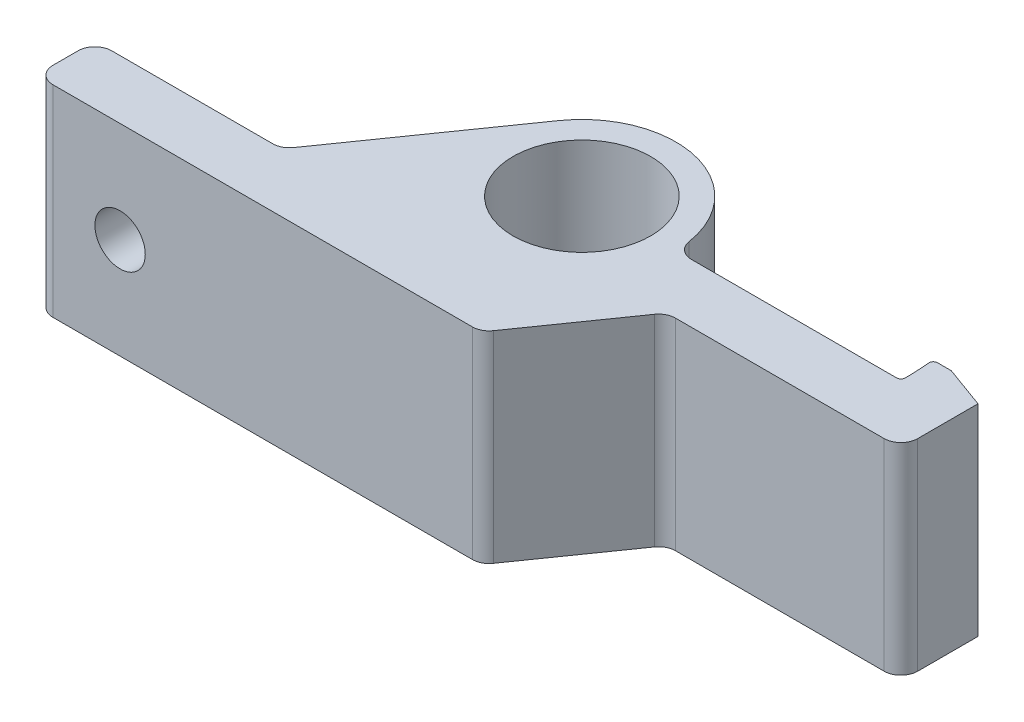
ISO-10303-21;
HEADER;
FILE_DESCRIPTION(('STEP AP214'),'2;1');
FILE_NAME('part.step','',(''),(''),'','','');
FILE_SCHEMA(('AUTOMOTIVE_DESIGN { 1 0 10303 214 1 1 1 1 }'));
ENDSEC;
DATA;
#1=APPLICATION_CONTEXT('core data for automotive mechanical design processes');
#2=APPLICATION_PROTOCOL_DEFINITION('international standard','automotive_design',2000,#1);
#3=PRODUCT_CONTEXT('',#1,'mechanical');
#4=PRODUCT('Part','Part','',(#3));
#5=PRODUCT_RELATED_PRODUCT_CATEGORY('part','',(#4));
#6=PRODUCT_DEFINITION_FORMATION('','',#4);
#7=PRODUCT_DEFINITION_CONTEXT('part definition',#1,'design');
#8=PRODUCT_DEFINITION('design','',#6,#7);
#9=PRODUCT_DEFINITION_SHAPE('','',#8);
#10=(LENGTH_UNIT() NAMED_UNIT(*) SI_UNIT(.MILLI.,.METRE.));
#11=(NAMED_UNIT(*) PLANE_ANGLE_UNIT() SI_UNIT($,.RADIAN.));
#12=(NAMED_UNIT(*) SI_UNIT($,.STERADIAN.) SOLID_ANGLE_UNIT());
#13=UNCERTAINTY_MEASURE_WITH_UNIT(LENGTH_MEASURE(1.E-05),#10,'distance_accuracy_value','');
#14=(GEOMETRIC_REPRESENTATION_CONTEXT(3) GLOBAL_UNCERTAINTY_ASSIGNED_CONTEXT((#13)) GLOBAL_UNIT_ASSIGNED_CONTEXT((#10,
#11,#12)) REPRESENTATION_CONTEXT('',''));
#15=CARTESIAN_POINT('',(0.,0.,0.));
#16=DIRECTION('',(0.,0.,1.));
#17=DIRECTION('',(1.,0.,0.));
#18=AXIS2_PLACEMENT_3D('',#15,#16,#17);
#19=CARTESIAN_POINT('',(0.,6.,0.));
#20=DIRECTION('',(0.,0.,-1.));
#21=DIRECTION('',(-1.,0.,0.));
#22=AXIS2_PLACEMENT_3D('',#19,#20,#21);
#23=PLANE('',#22);
#24=DIRECTION('',(1.,0.,0.));
#25=VECTOR('',#24,1.);
#26=CARTESIAN_POINT('',(0.,6.,0.));
#27=LINE('',#26,#25);
#28=CARTESIAN_POINT('',(1.,6.,0.));
#29=VERTEX_POINT('',#28);
#30=CARTESIAN_POINT('',(25.9794329494483,6.,0.));
#31=VERTEX_POINT('',#30);
#32=EDGE_CURVE('E260',#29,#31,#27,.T.);
#33=ORIENTED_EDGE('',*,*,#32,.F.);
#34=DIRECTION('',(0.,-1.,0.));
#35=VECTOR('',#34,1.);
#36=CARTESIAN_POINT('',(1.,6.,0.));
#37=LINE('',#36,#35);
#38=CARTESIAN_POINT('',(1.,-6.,0.));
#39=VERTEX_POINT('',#38);
#40=EDGE_CURVE('E352',#29,#39,#37,.T.);
#41=ORIENTED_EDGE('',*,*,#40,.T.);
#42=DIRECTION('',(1.,0.,0.));
#43=VECTOR('',#42,1.);
#44=CARTESIAN_POINT('',(0.,-6.,0.));
#45=LINE('',#44,#43);
#46=CARTESIAN_POINT('',(25.9794329494483,-6.,0.));
#47=VERTEX_POINT('',#46);
#48=EDGE_CURVE('E293',#39,#47,#45,.T.);
#49=ORIENTED_EDGE('',*,*,#48,.T.);
#50=DIRECTION('',(0.,-1.,0.));
#51=VECTOR('',#50,1.);
#52=CARTESIAN_POINT('',(25.9794329494483,6.,0.));
#53=LINE('',#52,#51);
#54=EDGE_CURVE('E350',#47,#31,#53,.F.);
#55=ORIENTED_EDGE('',*,*,#54,.T.);
#56=EDGE_LOOP('',(#33,#41,#49,#55));
#57=FACE_BOUND('',#56,.T.);
#58=CARTESIAN_POINT('',(5.,0.,0.));
#59=DIRECTION('',(0.,0.,1.));
#60=DIRECTION('',(1.,0.,0.));
#61=AXIS2_PLACEMENT_3D('',#58,#59,#60);
#62=CIRCLE('',#61,1.49999999999999);
#63=CARTESIAN_POINT('',(6.49999999999999,0.,0.));
#64=VERTEX_POINT('',#63);
#65=EDGE_CURVE('E400',#64,#64,#62,.T.);
#66=ORIENTED_EDGE('',*,*,#65,.F.);
#67=EDGE_LOOP('',(#66));
#68=FACE_BOUND('',#67,.T.);
#69=ADVANCED_FACE('F71',(#57,#68),#23,.F.);
#70=CARTESIAN_POINT('',(22.5,6.,-10.));
#71=DIRECTION('',(0.,1.,0.));
#72=DIRECTION('',(0.,0.,1.));
#73=AXIS2_PLACEMENT_3D('',#70,#71,#72);
#74=PLANE('',#73);
#75=DIRECTION('',(0.93969262078591,0.,0.342020143325663));
#76=VECTOR('',#75,1.);
#77=CARTESIAN_POINT('',(42.5,6.,-12.));
#78=LINE('',#77,#76);
#79=CARTESIAN_POINT('',(42.5,6.,-12.));
#80=VERTEX_POINT('',#79);
#81=CARTESIAN_POINT('',(45.,6.,-11.0900744143345));
#82=VERTEX_POINT('',#81);
#83=EDGE_CURVE('E221',#80,#82,#78,.T.);
#84=ORIENTED_EDGE('',*,*,#83,.F.);
#85=DIRECTION('',(-1.,0.,0.));
#86=VECTOR('',#85,1.);
#87=CARTESIAN_POINT('',(45.,6.,-12.));
#88=LINE('',#87,#86);
#89=CARTESIAN_POINT('',(41.6768946627021,6.,-12.));
#90=VERTEX_POINT('',#89);
#91=EDGE_CURVE('E230',#80,#90,#88,.T.);
#92=ORIENTED_EDGE('',*,*,#91,.T.);
#93=CARTESIAN_POINT('',(41.6768946627021,6.,-11.75));
#94=DIRECTION('',(0.,1.,0.));
#95=DIRECTION('',(0.,0.,1.));
#96=AXIS2_PLACEMENT_3D('',#93,#94,#95);
#97=CIRCLE('',#96,0.25);
#98=CARTESIAN_POINT('',(41.4279291552641,6.,-11.7272804906279));
#99=VERTEX_POINT('',#98);
#100=EDGE_CURVE('E307',#90,#99,#97,.T.);
#101=ORIENTED_EDGE('',*,*,#100,.T.);
#102=CARTESIAN_POINT('',(22.5,6.,-10.));
#103=DIRECTION('',(0.,-1.,0.));
#104=DIRECTION('',(0.,0.,1.));
#105=AXIS2_PLACEMENT_3D('',#102,#103,#104);
#106=CIRCLE('',#105,19.0065778087482);
#107=CARTESIAN_POINT('',(41.5,6.,-10.5));
#108=VERTEX_POINT('',#107);
#109=EDGE_CURVE('E411',#99,#108,#106,.T.);
#110=ORIENTED_EDGE('',*,*,#109,.T.);
#111=DIRECTION('',(0.,0.,1.));
#112=VECTOR('',#111,1.);
#113=CARTESIAN_POINT('',(41.5,6.,-12.));
#114=LINE('',#113,#112);
#115=CARTESIAN_POINT('',(41.5,6.,-10.25));
#116=VERTEX_POINT('',#115);
#117=EDGE_CURVE('E238',#108,#116,#114,.T.);
#118=ORIENTED_EDGE('',*,*,#117,.T.);
#119=CARTESIAN_POINT('',(41.25,6.,-10.25));
#120=DIRECTION('',(0.,1.,0.));
#121=DIRECTION('',(0.,0.,1.));
#122=AXIS2_PLACEMENT_3D('',#119,#120,#121);
#123=CIRCLE('',#122,0.25);
#124=CARTESIAN_POINT('',(41.25,6.,-10.));
#125=VERTEX_POINT('',#124);
#126=EDGE_CURVE('E316',#116,#125,#123,.F.);
#127=ORIENTED_EDGE('',*,*,#126,.T.);
#128=DIRECTION('',(-1.,0.,0.));
#129=VECTOR('',#128,1.);
#130=CARTESIAN_POINT('',(41.5,6.,-10.));
#131=LINE('',#130,#129);
#132=CARTESIAN_POINT('',(29.02380257212,6.,-10.));
#133=VERTEX_POINT('',#132);
#134=EDGE_CURVE('E241',#125,#133,#131,.T.);
#135=ORIENTED_EDGE('',*,*,#134,.T.);
#136=CARTESIAN_POINT('',(29.02380257212,6.,-11.));
#137=DIRECTION('',(0.,1.,0.));
#138=DIRECTION('',(0.,0.,1.));
#139=AXIS2_PLACEMENT_3D('',#136,#137,#138);
#140=CIRCLE('',#139,1.);
#141=CARTESIAN_POINT('',(28.0353476369503,6.,-10.8484848484848));
#142=VERTEX_POINT('',#141);
#143=EDGE_CURVE('E374',#133,#142,#140,.F.);
#144=ORIENTED_EDGE('',*,*,#143,.T.);
#145=CARTESIAN_POINT('',(22.5,6.,-10.));
#146=DIRECTION('',(0.,1.,0.));
#147=DIRECTION('',(0.,0.,1.));
#148=AXIS2_PLACEMENT_3D('',#145,#146,#147);
#149=CIRCLE('',#148,5.6);
#150=CARTESIAN_POINT('',(17.9127485519817,6.,-13.2120280435659));
#151=VERTEX_POINT('',#150);
#152=EDGE_CURVE('E249',#142,#151,#149,.T.);
#153=ORIENTED_EDGE('',*,*,#152,.T.);
#154=DIRECTION('',(0.57357643635105,0.,-0.819152044288989));
#155=VECTOR('',#154,1.);
#156=CARTESIAN_POINT('',(11.1123133045727,6.,-3.5));
#157=LINE('',#156,#155);
#158=CARTESIAN_POINT('',(11.4108982983099,6.,-3.92642356364895));
#159=VERTEX_POINT('',#158);
#160=EDGE_CURVE('E251',#159,#151,#157,.T.);
#161=ORIENTED_EDGE('',*,*,#160,.F.);
#162=CARTESIAN_POINT('',(10.5917462540209,6.,-4.5));
#163=DIRECTION('',(0.,1.,0.));
#164=DIRECTION('',(0.,0.,1.));
#165=AXIS2_PLACEMENT_3D('',#162,#163,#164);
#166=CIRCLE('',#165,1.);
#167=CARTESIAN_POINT('',(10.5917462540209,6.,-3.5));
#168=VERTEX_POINT('',#167);
#169=EDGE_CURVE('E370',#159,#168,#166,.F.);
#170=ORIENTED_EDGE('',*,*,#169,.T.);
#171=DIRECTION('',(-1.,0.,0.));
#172=VECTOR('',#171,1.);
#173=CARTESIAN_POINT('',(11.1123133045727,6.,-3.5));
#174=LINE('',#173,#172);
#175=CARTESIAN_POINT('',(1.,6.,-3.5));
#176=VERTEX_POINT('',#175);
#177=EDGE_CURVE('E254',#168,#176,#174,.T.);
#178=ORIENTED_EDGE('',*,*,#177,.T.);
#179=CARTESIAN_POINT('',(1.,6.,-2.5));
#180=DIRECTION('',(0.,1.,0.));
#181=DIRECTION('',(0.,0.,1.));
#182=AXIS2_PLACEMENT_3D('',#179,#180,#181);
#183=CIRCLE('',#182,1.);
#184=CARTESIAN_POINT('',(0.,6.,-2.5));
#185=VERTEX_POINT('',#184);
#186=EDGE_CURVE('E348',#176,#185,#183,.T.);
#187=ORIENTED_EDGE('',*,*,#186,.T.);
#188=DIRECTION('',(0.,0.,1.));
#189=VECTOR('',#188,1.);
#190=CARTESIAN_POINT('',(0.,6.,-3.5));
#191=LINE('',#190,#189);
#192=CARTESIAN_POINT('',(0.,6.,-1.));
#193=VERTEX_POINT('',#192);
#194=EDGE_CURVE('E257',#185,#193,#191,.T.);
#195=ORIENTED_EDGE('',*,*,#194,.T.);
#196=CARTESIAN_POINT('',(1.,6.,-1.));
#197=DIRECTION('',(0.,1.,0.));
#198=DIRECTION('',(0.,0.,1.));
#199=AXIS2_PLACEMENT_3D('',#196,#197,#198);
#200=CIRCLE('',#199,1.);
#201=EDGE_CURVE('E346',#193,#29,#200,.T.);
#202=ORIENTED_EDGE('',*,*,#201,.T.);
#203=ORIENTED_EDGE('',*,*,#32,.T.);
#204=CARTESIAN_POINT('',(25.9794329494483,6.,-1.));
#205=DIRECTION('',(0.,1.,0.));
#206=DIRECTION('',(0.,0.,1.));
#207=AXIS2_PLACEMENT_3D('',#204,#205,#206);
#208=CIRCLE('',#207,1.);
#209=CARTESIAN_POINT('',(26.7985849937372,6.,-0.426423563648957));
#210=VERTEX_POINT('',#209);
#211=EDGE_CURVE('E343',#31,#210,#208,.T.);
#212=ORIENTED_EDGE('',*,*,#211,.T.);
#213=DIRECTION('',(0.573576436351044,0.,-0.819152044288993));
#214=VECTOR('',#213,1.);
#215=CARTESIAN_POINT('',(26.5,6.,0.));
#216=LINE('',#215,#214);
#217=CARTESIAN_POINT('',(30.7527640046258,6.,-6.07357643635105));
#218=VERTEX_POINT('',#217);
#219=EDGE_CURVE('E263',#210,#218,#216,.T.);
#220=ORIENTED_EDGE('',*,*,#219,.T.);
#221=CARTESIAN_POINT('',(31.5719160489148,6.,-5.5));
#222=DIRECTION('',(0.,1.,0.));
#223=DIRECTION('',(0.,0.,1.));
#224=AXIS2_PLACEMENT_3D('',#221,#222,#223);
#225=CIRCLE('',#224,1.);
#226=CARTESIAN_POINT('',(31.5719160489148,6.,-6.5));
#227=VERTEX_POINT('',#226);
#228=EDGE_CURVE('E12',#218,#227,#225,.F.);
#229=ORIENTED_EDGE('',*,*,#228,.T.);
#230=DIRECTION('',(1.,0.,0.));
#231=VECTOR('',#230,1.);
#232=CARTESIAN_POINT('',(31.0513489983631,6.,-6.5));
#233=LINE('',#232,#231);
#234=CARTESIAN_POINT('',(44.,6.,-6.5));
#235=VERTEX_POINT('',#234);
#236=EDGE_CURVE('E243',#227,#235,#233,.T.);
#237=ORIENTED_EDGE('',*,*,#236,.T.);
#238=CARTESIAN_POINT('',(44.,6.,-7.5));
#239=DIRECTION('',(0.,1.,0.));
#240=DIRECTION('',(0.,0.,1.));
#241=AXIS2_PLACEMENT_3D('',#238,#239,#240);
#242=CIRCLE('',#241,1.);
#243=CARTESIAN_POINT('',(45.,6.,-7.5));
#244=VERTEX_POINT('',#243);
#245=EDGE_CURVE('E94',#235,#244,#242,.T.);
#246=ORIENTED_EDGE('',*,*,#245,.T.);
#247=DIRECTION('',(0.,0.,-1.));
#248=VECTOR('',#247,1.);
#249=CARTESIAN_POINT('',(45.,6.,-6.5));
#250=LINE('',#249,#248);
#251=EDGE_CURVE('E232',#244,#82,#250,.T.);
#252=ORIENTED_EDGE('',*,*,#251,.T.);
#253=EDGE_LOOP('',(#84,#92,#101,#110,#118,#127,#135,#144,#153,#161,#170,#178,#187,#195,#202,
#203,#212,#220,#229,#237,#246,#252));
#254=FACE_BOUND('',#253,.T.);
#255=CARTESIAN_POINT('',(22.5,6.,-10.));
#256=DIRECTION('',(0.,1.,0.));
#257=DIRECTION('',(0.,0.,1.));
#258=AXIS2_PLACEMENT_3D('',#255,#256,#257);
#259=CIRCLE('',#258,4.1);
#260=CARTESIAN_POINT('',(22.5,6.,-5.9));
#261=VERTEX_POINT('',#260);
#262=EDGE_CURVE('E271',#261,#261,#259,.T.);
#263=ORIENTED_EDGE('',*,*,#262,.F.);
#264=EDGE_LOOP('',(#263));
#265=FACE_BOUND('',#264,.T.);
#266=ADVANCED_FACE('F228',(#254,#265),#74,.T.);
#267=CARTESIAN_POINT('',(22.5,-6.,-10.));
#268=DIRECTION('',(0.,1.,0.));
#269=DIRECTION('',(0.,0.,1.));
#270=AXIS2_PLACEMENT_3D('',#267,#268,#269);
#271=PLANE('',#270);
#272=DIRECTION('',(-1.,0.,0.));
#273=VECTOR('',#272,1.);
#274=CARTESIAN_POINT('',(45.,-6.,-12.));
#275=LINE('',#274,#273);
#276=CARTESIAN_POINT('',(42.5,-6.,-12.));
#277=VERTEX_POINT('',#276);
#278=CARTESIAN_POINT('',(41.6768946627021,-6.,-12.));
#279=VERTEX_POINT('',#278);
#280=EDGE_CURVE('E274',#277,#279,#275,.T.);
#281=ORIENTED_EDGE('',*,*,#280,.F.);
#282=DIRECTION('',(-0.93969262078591,0.,-0.342020143325663));
#283=VECTOR('',#282,1.);
#284=CARTESIAN_POINT('',(42.5,-6.,-12.));
#285=LINE('',#284,#283);
#286=CARTESIAN_POINT('',(45.,-6.,-11.0900744143345));
#287=VERTEX_POINT('',#286);
#288=EDGE_CURVE('E86',#287,#277,#285,.T.);
#289=ORIENTED_EDGE('',*,*,#288,.F.);
#290=DIRECTION('',(0.,0.,-1.));
#291=VECTOR('',#290,1.);
#292=CARTESIAN_POINT('',(45.,-6.,-6.5));
#293=LINE('',#292,#291);
#294=CARTESIAN_POINT('',(45.,-6.,-7.5));
#295=VERTEX_POINT('',#294);
#296=EDGE_CURVE('E270',#295,#287,#293,.T.);
#297=ORIENTED_EDGE('',*,*,#296,.F.);
#298=CARTESIAN_POINT('',(44.,-6.,-7.5));
#299=DIRECTION('',(0.,1.,0.));
#300=DIRECTION('',(0.,0.,1.));
#301=AXIS2_PLACEMENT_3D('',#298,#299,#300);
#302=CIRCLE('',#301,1.);
#303=CARTESIAN_POINT('',(44.,-6.,-6.5));
#304=VERTEX_POINT('',#303);
#305=EDGE_CURVE('E337',#295,#304,#302,.F.);
#306=ORIENTED_EDGE('',*,*,#305,.T.);
#307=DIRECTION('',(1.,0.,0.));
#308=VECTOR('',#307,1.);
#309=CARTESIAN_POINT('',(31.0513489983631,-6.,-6.5));
#310=LINE('',#309,#308);
#311=CARTESIAN_POINT('',(31.5719160489148,-6.,-6.5));
#312=VERTEX_POINT('',#311);
#313=EDGE_CURVE('E267',#312,#304,#310,.T.);
#314=ORIENTED_EDGE('',*,*,#313,.F.);
#315=CARTESIAN_POINT('',(31.5719160489148,-6.,-5.5));
#316=DIRECTION('',(0.,1.,0.));
#317=DIRECTION('',(0.,0.,1.));
#318=AXIS2_PLACEMENT_3D('',#315,#316,#317);
#319=CIRCLE('',#318,1.);
#320=CARTESIAN_POINT('',(30.7527640046258,-6.,-6.07357643635105));
#321=VERTEX_POINT('',#320);
#322=EDGE_CURVE('E79',#312,#321,#319,.T.);
#323=ORIENTED_EDGE('',*,*,#322,.T.);
#324=DIRECTION('',(0.573576436351044,0.,-0.819152044288993));
#325=VECTOR('',#324,1.);
#326=CARTESIAN_POINT('',(26.5,-6.,0.));
#327=LINE('',#326,#325);
#328=CARTESIAN_POINT('',(26.7985849937372,-6.,-0.426423563648957));
#329=VERTEX_POINT('',#328);
#330=EDGE_CURVE('E296',#329,#321,#327,.T.);
#331=ORIENTED_EDGE('',*,*,#330,.F.);
#332=CARTESIAN_POINT('',(25.9794329494483,-6.,-1.));
#333=DIRECTION('',(0.,1.,0.));
#334=DIRECTION('',(0.,0.,1.));
#335=AXIS2_PLACEMENT_3D('',#332,#333,#334);
#336=CIRCLE('',#335,1.);
#337=EDGE_CURVE('E335',#329,#47,#336,.F.);
#338=ORIENTED_EDGE('',*,*,#337,.T.);
#339=ORIENTED_EDGE('',*,*,#48,.F.);
#340=CARTESIAN_POINT('',(1.,-6.,-1.));
#341=DIRECTION('',(0.,1.,0.));
#342=DIRECTION('',(0.,0.,1.));
#343=AXIS2_PLACEMENT_3D('',#340,#341,#342);
#344=CIRCLE('',#343,1.);
#345=CARTESIAN_POINT('',(0.,-6.,-1.));
#346=VERTEX_POINT('',#345);
#347=EDGE_CURVE('E339',#39,#346,#344,.F.);
#348=ORIENTED_EDGE('',*,*,#347,.T.);
#349=DIRECTION('',(0.,0.,1.));
#350=VECTOR('',#349,1.);
#351=CARTESIAN_POINT('',(0.,-6.,-3.5));
#352=LINE('',#351,#350);
#353=CARTESIAN_POINT('',(0.,-6.,-2.5));
#354=VERTEX_POINT('',#353);
#355=EDGE_CURVE('E290',#354,#346,#352,.T.);
#356=ORIENTED_EDGE('',*,*,#355,.F.);
#357=CARTESIAN_POINT('',(1.,-6.,-2.5));
#358=DIRECTION('',(0.,1.,0.));
#359=DIRECTION('',(0.,0.,1.));
#360=AXIS2_PLACEMENT_3D('',#357,#358,#359);
#361=CIRCLE('',#360,1.);
#362=CARTESIAN_POINT('',(1.,-6.,-3.5));
#363=VERTEX_POINT('',#362);
#364=EDGE_CURVE('E341',#354,#363,#361,.F.);
#365=ORIENTED_EDGE('',*,*,#364,.T.);
#366=DIRECTION('',(-1.,0.,0.));
#367=VECTOR('',#366,1.);
#368=CARTESIAN_POINT('',(11.1123133045727,-6.,-3.5));
#369=LINE('',#368,#367);
#370=CARTESIAN_POINT('',(10.5917462540209,-6.,-3.5));
#371=VERTEX_POINT('',#370);
#372=EDGE_CURVE('E287',#371,#363,#369,.T.);
#373=ORIENTED_EDGE('',*,*,#372,.F.);
#374=CARTESIAN_POINT('',(10.5917462540209,-6.,-4.5));
#375=DIRECTION('',(0.,1.,0.));
#376=DIRECTION('',(0.,0.,1.));
#377=AXIS2_PLACEMENT_3D('',#374,#375,#376);
#378=CIRCLE('',#377,1.);
#379=CARTESIAN_POINT('',(11.4108982983099,-6.,-3.92642356364895));
#380=VERTEX_POINT('',#379);
#381=EDGE_CURVE('E368',#371,#380,#378,.T.);
#382=ORIENTED_EDGE('',*,*,#381,.T.);
#383=DIRECTION('',(0.57357643635105,0.,-0.819152044288989));
#384=VECTOR('',#383,1.);
#385=CARTESIAN_POINT('',(11.1123133045727,-6.,-3.5));
#386=LINE('',#385,#384);
#387=CARTESIAN_POINT('',(17.9127485519817,-6.,-13.2120280435659));
#388=VERTEX_POINT('',#387);
#389=EDGE_CURVE('E284',#380,#388,#386,.T.);
#390=ORIENTED_EDGE('',*,*,#389,.T.);
#391=CARTESIAN_POINT('',(22.5,-6.,-10.));
#392=DIRECTION('',(0.,1.,0.));
#393=DIRECTION('',(0.,0.,1.));
#394=AXIS2_PLACEMENT_3D('',#391,#392,#393);
#395=CIRCLE('',#394,5.6);
#396=CARTESIAN_POINT('',(28.0353476369503,-6.,-10.8484848484848));
#397=VERTEX_POINT('',#396);
#398=EDGE_CURVE('E282',#397,#388,#395,.T.);
#399=ORIENTED_EDGE('',*,*,#398,.F.);
#400=CARTESIAN_POINT('',(29.02380257212,-6.,-11.));
#401=DIRECTION('',(0.,1.,0.));
#402=DIRECTION('',(0.,0.,1.));
#403=AXIS2_PLACEMENT_3D('',#400,#401,#402);
#404=CIRCLE('',#403,1.);
#405=CARTESIAN_POINT('',(29.02380257212,-6.,-10.));
#406=VERTEX_POINT('',#405);
#407=EDGE_CURVE('E372',#397,#406,#404,.T.);
#408=ORIENTED_EDGE('',*,*,#407,.T.);
#409=DIRECTION('',(-1.,0.,0.));
#410=VECTOR('',#409,1.);
#411=CARTESIAN_POINT('',(41.5,-6.,-10.));
#412=LINE('',#411,#410);
#413=CARTESIAN_POINT('',(41.25,-6.,-10.));
#414=VERTEX_POINT('',#413);
#415=EDGE_CURVE('E279',#414,#406,#412,.T.);
#416=ORIENTED_EDGE('',*,*,#415,.F.);
#417=CARTESIAN_POINT('',(41.25,-6.,-10.25));
#418=DIRECTION('',(0.,1.,0.));
#419=DIRECTION('',(0.,0.,1.));
#420=AXIS2_PLACEMENT_3D('',#417,#418,#419);
#421=CIRCLE('',#420,0.25);
#422=CARTESIAN_POINT('',(41.5,-6.,-10.25));
#423=VERTEX_POINT('',#422);
#424=EDGE_CURVE('E314',#414,#423,#421,.T.);
#425=ORIENTED_EDGE('',*,*,#424,.T.);
#426=DIRECTION('',(0.,0.,1.));
#427=VECTOR('',#426,1.);
#428=CARTESIAN_POINT('',(41.5,-6.,-12.));
#429=LINE('',#428,#427);
#430=CARTESIAN_POINT('',(41.5,-6.,-10.5));
#431=VERTEX_POINT('',#430);
#432=EDGE_CURVE('E276',#431,#423,#429,.T.);
#433=ORIENTED_EDGE('',*,*,#432,.F.);
#434=CARTESIAN_POINT('',(22.5,-6.,-10.));
#435=DIRECTION('',(0.,1.,0.));
#436=DIRECTION('',(0.,0.,1.));
#437=AXIS2_PLACEMENT_3D('',#434,#435,#436);
#438=CIRCLE('',#437,19.0065778087482);
#439=CARTESIAN_POINT('',(41.4279291552641,-6.,-11.7272804906279));
#440=VERTEX_POINT('',#439);
#441=EDGE_CURVE('E403',#431,#440,#438,.T.);
#442=ORIENTED_EDGE('',*,*,#441,.T.);
#443=CARTESIAN_POINT('',(41.6768946627021,-6.,-11.75));
#444=DIRECTION('',(0.,1.,0.));
#445=DIRECTION('',(0.,0.,1.));
#446=AXIS2_PLACEMENT_3D('',#443,#444,#445);
#447=CIRCLE('',#446,0.25);
#448=EDGE_CURVE('E311',#440,#279,#447,.F.);
#449=ORIENTED_EDGE('',*,*,#448,.T.);
#450=EDGE_LOOP('',(#281,#289,#297,#306,#314,#323,#331,#338,#339,#348,#356,#365,#373,#382,#390,
#399,#408,#416,#425,#433,#442,#449));
#451=FACE_BOUND('',#450,.T.);
#452=CARTESIAN_POINT('',(22.5,-6.,-10.));
#453=DIRECTION('',(0.,1.,0.));
#454=DIRECTION('',(0.,0.,1.));
#455=AXIS2_PLACEMENT_3D('',#452,#453,#454);
#456=CIRCLE('',#455,4.1);
#457=CARTESIAN_POINT('',(22.5,-6.,-5.9));
#458=VERTEX_POINT('',#457);
#459=EDGE_CURVE('E394',#458,#458,#456,.T.);
#460=ORIENTED_EDGE('',*,*,#459,.T.);
#461=EDGE_LOOP('',(#460));
#462=FACE_BOUND('',#461,.T.);
#463=ADVANCED_FACE('F378',(#451,#462),#271,.F.);
#464=CARTESIAN_POINT('',(31.0513489983631,6.,-6.5));
#465=DIRECTION('',(0.,0.,-1.));
#466=DIRECTION('',(-1.,0.,0.));
#467=AXIS2_PLACEMENT_3D('',#464,#465,#466);
#468=PLANE('',#467);
#469=ORIENTED_EDGE('',*,*,#313,.T.);
#470=DIRECTION('',(0.,-1.,0.));
#471=VECTOR('',#470,1.);
#472=CARTESIAN_POINT('',(44.,6.,-6.5));
#473=LINE('',#472,#471);
#474=EDGE_CURVE('E361',#304,#235,#473,.F.);
#475=ORIENTED_EDGE('',*,*,#474,.T.);
#476=ORIENTED_EDGE('',*,*,#236,.F.);
#477=DIRECTION('',(0.,-1.,0.));
#478=VECTOR('',#477,1.);
#479=CARTESIAN_POINT('',(31.5719160489148,-6.,-6.5));
#480=LINE('',#479,#478);
#481=EDGE_CURVE('E358',#227,#312,#480,.T.);
#482=ORIENTED_EDGE('',*,*,#481,.T.);
#483=EDGE_LOOP('',(#469,#475,#476,#482));
#484=FACE_BOUND('',#483,.T.);
#485=ADVANCED_FACE('F391',(#484),#468,.F.);
#486=CARTESIAN_POINT('',(45.,6.,-6.5));
#487=DIRECTION('',(-1.,0.,0.));
#488=DIRECTION('',(0.,0.,1.));
#489=AXIS2_PLACEMENT_3D('',#486,#487,#488);
#490=PLANE('',#489);
#491=ORIENTED_EDGE('',*,*,#296,.T.);
#492=DIRECTION('',(0.,1.,0.));
#493=VECTOR('',#492,1.);
#494=CARTESIAN_POINT('',(45.,-8.66044443118978,-11.0900744143345));
#495=LINE('',#494,#493);
#496=EDGE_CURVE('E226',#287,#82,#495,.T.);
#497=ORIENTED_EDGE('',*,*,#496,.T.);
#498=ORIENTED_EDGE('',*,*,#251,.F.);
#499=DIRECTION('',(0.,-1.,0.));
#500=VECTOR('',#499,1.);
#501=CARTESIAN_POINT('',(45.,6.,-7.5));
#502=LINE('',#501,#500);
#503=EDGE_CURVE('E355',#244,#295,#502,.T.);
#504=ORIENTED_EDGE('',*,*,#503,.T.);
#505=EDGE_LOOP('',(#491,#497,#498,#504));
#506=FACE_BOUND('',#505,.T.);
#507=ADVANCED_FACE('F415',(#506),#490,.F.);
#508=CARTESIAN_POINT('',(45.,6.,-12.));
#509=DIRECTION('',(0.,0.,1.));
#510=DIRECTION('',(1.,0.,0.));
#511=AXIS2_PLACEMENT_3D('',#508,#509,#510);
#512=PLANE('',#511);
#513=ORIENTED_EDGE('',*,*,#91,.F.);
#514=DIRECTION('',(0.,1.,0.));
#515=VECTOR('',#514,1.);
#516=CARTESIAN_POINT('',(42.5,-8.66044443118978,-12.));
#517=LINE('',#516,#515);
#518=EDGE_CURVE('E218',#277,#80,#517,.T.);
#519=ORIENTED_EDGE('',*,*,#518,.F.);
#520=ORIENTED_EDGE('',*,*,#280,.T.);
#521=DIRECTION('',(0.,-1.,0.));
#522=VECTOR('',#521,1.);
#523=CARTESIAN_POINT('',(41.6768946627021,6.,-12.));
#524=LINE('',#523,#522);
#525=EDGE_CURVE('E237',#279,#90,#524,.F.);
#526=ORIENTED_EDGE('',*,*,#525,.T.);
#527=EDGE_LOOP('',(#513,#519,#520,#526));
#528=FACE_BOUND('',#527,.T.);
#529=ADVANCED_FACE('F235',(#528),#512,.F.);
#530=CARTESIAN_POINT('',(41.5,6.,-12.));
#531=DIRECTION('',(1.,0.,0.));
#532=DIRECTION('',(0.,0.,-1.));
#533=AXIS2_PLACEMENT_3D('',#530,#531,#532);
#534=PLANE('',#533);
#535=ORIENTED_EDGE('',*,*,#432,.T.);
#536=DIRECTION('',(0.,-1.,0.));
#537=VECTOR('',#536,1.);
#538=CARTESIAN_POINT('',(41.5,6.,-10.25));
#539=LINE('',#538,#537);
#540=EDGE_CURVE('E304',#423,#116,#539,.F.);
#541=ORIENTED_EDGE('',*,*,#540,.T.);
#542=ORIENTED_EDGE('',*,*,#117,.F.);
#543=DIRECTION('',(0.,1.,0.));
#544=VECTOR('',#543,1.);
#545=CARTESIAN_POINT('',(41.5,-7.50325962010547,-10.5));
#546=LINE('',#545,#544);
#547=EDGE_CURVE('E408',#431,#108,#546,.T.);
#548=ORIENTED_EDGE('',*,*,#547,.F.);
#549=EDGE_LOOP('',(#535,#541,#542,#548));
#550=FACE_BOUND('',#549,.T.);
#551=ADVANCED_FACE('F429',(#550),#534,.F.);
#552=CARTESIAN_POINT('',(41.5,6.,-10.));
#553=DIRECTION('',(0.,0.,1.));
#554=DIRECTION('',(1.,0.,0.));
#555=AXIS2_PLACEMENT_3D('',#552,#553,#554);
#556=PLANE('',#555);
#557=ORIENTED_EDGE('',*,*,#415,.T.);
#558=DIRECTION('',(0.,1.,0.));
#559=VECTOR('',#558,1.);
#560=CARTESIAN_POINT('',(29.02380257212,6.,-10.));
#561=LINE('',#560,#559);
#562=EDGE_CURVE('E328',#406,#133,#561,.T.);
#563=ORIENTED_EDGE('',*,*,#562,.T.);
#564=ORIENTED_EDGE('',*,*,#134,.F.);
#565=DIRECTION('',(0.,-1.,0.));
#566=VECTOR('',#565,1.);
#567=CARTESIAN_POINT('',(41.25,-6.,-10.));
#568=LINE('',#567,#566);
#569=EDGE_CURVE('E301',#125,#414,#568,.T.);
#570=ORIENTED_EDGE('',*,*,#569,.T.);
#571=EDGE_LOOP('',(#557,#563,#564,#570));
#572=FACE_BOUND('',#571,.T.);
#573=ADVANCED_FACE('F438',(#572),#556,.F.);
#574=CARTESIAN_POINT('',(22.5,6.,-10.));
#575=DIRECTION('',(0.,-1.,0.));
#576=DIRECTION('',(0.,0.,-1.));
#577=AXIS2_PLACEMENT_3D('',#574,#575,#576);
#578=CYLINDRICAL_SURFACE('',#577,5.6);
#579=ORIENTED_EDGE('',*,*,#152,.F.);
#580=DIRECTION('',(0.,-1.,0.));
#581=VECTOR('',#580,1.);
#582=CARTESIAN_POINT('',(28.0353476369503,6.,-10.8484848484848));
#583=LINE('',#582,#581);
#584=EDGE_CURVE('E325',#142,#397,#583,.T.);
#585=ORIENTED_EDGE('',*,*,#584,.T.);
#586=ORIENTED_EDGE('',*,*,#398,.T.);
#587=DIRECTION('',(0.,-1.,0.));
#588=VECTOR('',#587,1.);
#589=CARTESIAN_POINT('',(17.9127485519817,6.,-13.2120280435659));
#590=LINE('',#589,#588);
#591=EDGE_CURVE('E266',#151,#388,#590,.T.);
#592=ORIENTED_EDGE('',*,*,#591,.F.);
#593=EDGE_LOOP('',(#579,#585,#586,#592));
#594=FACE_BOUND('',#593,.T.);
#595=ADVANCED_FACE('F447',(#594),#578,.T.);
#596=CARTESIAN_POINT('',(11.1123133045727,6.,-3.5));
#597=DIRECTION('',(-0.819152044288989,0.,-0.57357643635105));
#598=DIRECTION('',(-0.57357643635105,0.,0.819152044288989));
#599=AXIS2_PLACEMENT_3D('',#596,#597,#598);
#600=PLANE('',#599);
#601=ORIENTED_EDGE('',*,*,#389,.F.);
#602=DIRECTION('',(0.,-1.,0.));
#603=VECTOR('',#602,1.);
#604=CARTESIAN_POINT('',(11.4108982983099,6.,-3.92642356364895));
#605=LINE('',#604,#603);
#606=EDGE_CURVE('E323',#380,#159,#605,.F.);
#607=ORIENTED_EDGE('',*,*,#606,.T.);
#608=ORIENTED_EDGE('',*,*,#160,.T.);
#609=ORIENTED_EDGE('',*,*,#591,.T.);
#610=EDGE_LOOP('',(#601,#607,#608,#609));
#611=FACE_BOUND('',#610,.T.);
#612=ADVANCED_FACE('F453',(#611),#600,.T.);
#613=CARTESIAN_POINT('',(11.1123133045727,6.,-3.5));
#614=DIRECTION('',(0.,0.,1.));
#615=DIRECTION('',(1.,0.,0.));
#616=AXIS2_PLACEMENT_3D('',#613,#614,#615);
#617=PLANE('',#616);
#618=CARTESIAN_POINT('',(5.,0.,-3.5));
#619=DIRECTION('',(0.,0.,1.));
#620=DIRECTION('',(1.,0.,0.));
#621=AXIS2_PLACEMENT_3D('',#618,#619,#620);
#622=CIRCLE('',#621,1.49999999999999);
#623=CARTESIAN_POINT('',(6.5,0.,-3.5));
#624=VERTEX_POINT('',#623);
#625=EDGE_CURVE('E397',#624,#624,#622,.F.);
#626=ORIENTED_EDGE('',*,*,#625,.F.);
#627=EDGE_LOOP('',(#626));
#628=FACE_BOUND('',#627,.T.);
#629=ORIENTED_EDGE('',*,*,#177,.F.);
#630=DIRECTION('',(0.,-1.,0.));
#631=VECTOR('',#630,1.);
#632=CARTESIAN_POINT('',(10.5917462540209,6.,-3.5));
#633=LINE('',#632,#631);
#634=EDGE_CURVE('E320',#168,#371,#633,.T.);
#635=ORIENTED_EDGE('',*,*,#634,.T.);
#636=ORIENTED_EDGE('',*,*,#372,.T.);
#637=DIRECTION('',(0.,-1.,0.));
#638=VECTOR('',#637,1.);
#639=CARTESIAN_POINT('',(1.,6.,-3.5));
#640=LINE('',#639,#638);
#641=EDGE_CURVE('E318',#363,#176,#640,.F.);
#642=ORIENTED_EDGE('',*,*,#641,.T.);
#643=EDGE_LOOP('',(#629,#635,#636,#642));
#644=FACE_BOUND('',#643,.T.);
#645=ADVANCED_FACE('F461',(#628,#644),#617,.F.);
#646=CARTESIAN_POINT('',(0.,6.,-3.5));
#647=DIRECTION('',(1.,0.,0.));
#648=DIRECTION('',(0.,0.,-1.));
#649=AXIS2_PLACEMENT_3D('',#646,#647,#648);
#650=PLANE('',#649);
#651=ORIENTED_EDGE('',*,*,#194,.F.);
#652=DIRECTION('',(0.,-1.,0.));
#653=VECTOR('',#652,1.);
#654=CARTESIAN_POINT('',(0.,6.,-2.5));
#655=LINE('',#654,#653);
#656=EDGE_CURVE('E332',#185,#354,#655,.T.);
#657=ORIENTED_EDGE('',*,*,#656,.T.);
#658=ORIENTED_EDGE('',*,*,#355,.T.);
#659=DIRECTION('',(0.,-1.,0.));
#660=VECTOR('',#659,1.);
#661=CARTESIAN_POINT('',(0.,6.,-1.));
#662=LINE('',#661,#660);
#663=EDGE_CURVE('E330',#346,#193,#662,.F.);
#664=ORIENTED_EDGE('',*,*,#663,.T.);
#665=EDGE_LOOP('',(#651,#657,#658,#664));
#666=FACE_BOUND('',#665,.T.);
#667=ADVANCED_FACE('F470',(#666),#650,.F.);
#668=CARTESIAN_POINT('',(26.5,6.,0.));
#669=DIRECTION('',(-0.819152044288993,0.,-0.573576436351044));
#670=DIRECTION('',(-0.573576436351044,0.,0.819152044288993));
#671=AXIS2_PLACEMENT_3D('',#668,#669,#670);
#672=PLANE('',#671);
#673=ORIENTED_EDGE('',*,*,#330,.T.);
#674=DIRECTION('',(0.,-1.,0.));
#675=VECTOR('',#674,1.);
#676=CARTESIAN_POINT('',(30.7527640046258,6.,-6.07357643635104));
#677=LINE('',#676,#675);
#678=EDGE_CURVE('E366',#321,#218,#677,.F.);
#679=ORIENTED_EDGE('',*,*,#678,.T.);
#680=ORIENTED_EDGE('',*,*,#219,.F.);
#681=DIRECTION('',(0.,-1.,0.));
#682=VECTOR('',#681,1.);
#683=CARTESIAN_POINT('',(26.7985849937372,6.,-0.426423563648957));
#684=LINE('',#683,#682);
#685=EDGE_CURVE('E363',#210,#329,#684,.T.);
#686=ORIENTED_EDGE('',*,*,#685,.T.);
#687=EDGE_LOOP('',(#673,#679,#680,#686));
#688=FACE_BOUND('',#687,.T.);
#689=ADVANCED_FACE('F384',(#688),#672,.F.);
#690=CARTESIAN_POINT('',(22.5,6.,-10.));
#691=DIRECTION('',(0.,-1.,0.));
#692=DIRECTION('',(0.,0.,-1.));
#693=AXIS2_PLACEMENT_3D('',#690,#691,#692);
#694=CYLINDRICAL_SURFACE('',#693,4.1);
#695=ORIENTED_EDGE('',*,*,#262,.T.);
#696=EDGE_LOOP('',(#695));
#697=FACE_BOUND('',#696,.T.);
#698=ORIENTED_EDGE('',*,*,#459,.F.);
#699=EDGE_LOOP('',(#698));
#700=FACE_BOUND('',#699,.T.);
#701=ADVANCED_FACE('F616',(#697,#700),#694,.F.);
#702=CARTESIAN_POINT('',(5.,0.,0.));
#703=DIRECTION('',(0.,0.,1.));
#704=DIRECTION('',(1.,0.,0.));
#705=AXIS2_PLACEMENT_3D('',#702,#703,#704);
#706=CYLINDRICAL_SURFACE('',#705,1.49999999999999);
#707=ORIENTED_EDGE('',*,*,#625,.T.);
#708=EDGE_LOOP('',(#707));
#709=FACE_BOUND('',#708,.T.);
#710=ORIENTED_EDGE('',*,*,#65,.T.);
#711=EDGE_LOOP('',(#710));
#712=FACE_BOUND('',#711,.T.);
#713=ADVANCED_FACE('F623',(#709,#712),#706,.F.);
#714=CARTESIAN_POINT('',(22.5,-7.50325962010547,-10.));
#715=DIRECTION('',(0.,1.,0.));
#716=DIRECTION('',(0.,0.,1.));
#717=AXIS2_PLACEMENT_3D('',#714,#715,#716);
#718=CYLINDRICAL_SURFACE('',#717,19.0065778087482);
#719=ORIENTED_EDGE('',*,*,#109,.F.);
#720=DIRECTION('',(0.,1.,0.));
#721=VECTOR('',#720,1.);
#722=CARTESIAN_POINT('',(41.4279291552641,-7.50325962010547,-11.7272804906279));
#723=LINE('',#722,#721);
#724=EDGE_CURVE('E309',#99,#440,#723,.F.);
#725=ORIENTED_EDGE('',*,*,#724,.T.);
#726=ORIENTED_EDGE('',*,*,#441,.F.);
#727=ORIENTED_EDGE('',*,*,#547,.T.);
#728=EDGE_LOOP('',(#719,#725,#726,#727));
#729=FACE_BOUND('',#728,.T.);
#730=ADVANCED_FACE('F426',(#729),#718,.F.);
#731=CARTESIAN_POINT('',(41.25,6.,-10.25));
#732=DIRECTION('',(0.,1.,0.));
#733=DIRECTION('',(0.,0.,1.));
#734=AXIS2_PLACEMENT_3D('',#731,#732,#733);
#735=CYLINDRICAL_SURFACE('',#734,0.25);
#736=ORIENTED_EDGE('',*,*,#126,.F.);
#737=ORIENTED_EDGE('',*,*,#540,.F.);
#738=ORIENTED_EDGE('',*,*,#424,.F.);
#739=ORIENTED_EDGE('',*,*,#569,.F.);
#740=EDGE_LOOP('',(#736,#737,#738,#739));
#741=FACE_BOUND('',#740,.T.);
#742=ADVANCED_FACE('F435',(#741),#735,.F.);
#743=CARTESIAN_POINT('',(41.6768946627021,-7.50325962010547,-11.75));
#744=DIRECTION('',(0.,1.,0.));
#745=DIRECTION('',(0.,0.,1.));
#746=AXIS2_PLACEMENT_3D('',#743,#744,#745);
#747=CYLINDRICAL_SURFACE('',#746,0.25);
#748=ORIENTED_EDGE('',*,*,#448,.F.);
#749=ORIENTED_EDGE('',*,*,#724,.F.);
#750=ORIENTED_EDGE('',*,*,#100,.F.);
#751=ORIENTED_EDGE('',*,*,#525,.F.);
#752=EDGE_LOOP('',(#748,#749,#750,#751));
#753=FACE_BOUND('',#752,.T.);
#754=ADVANCED_FACE('F422',(#753),#747,.T.);
#755=CARTESIAN_POINT('',(10.5917462540209,6.,-4.5));
#756=DIRECTION('',(0.,-1.,0.));
#757=DIRECTION('',(0.,0.,-1.));
#758=AXIS2_PLACEMENT_3D('',#755,#756,#757);
#759=CYLINDRICAL_SURFACE('',#758,1.);
#760=ORIENTED_EDGE('',*,*,#169,.F.);
#761=ORIENTED_EDGE('',*,*,#606,.F.);
#762=ORIENTED_EDGE('',*,*,#381,.F.);
#763=ORIENTED_EDGE('',*,*,#634,.F.);
#764=EDGE_LOOP('',(#760,#761,#762,#763));
#765=FACE_BOUND('',#764,.T.);
#766=ADVANCED_FACE('F456',(#765),#759,.F.);
#767=CARTESIAN_POINT('',(29.02380257212,6.,-11.));
#768=DIRECTION('',(0.,-1.,0.));
#769=DIRECTION('',(0.,0.,-1.));
#770=AXIS2_PLACEMENT_3D('',#767,#768,#769);
#771=CYLINDRICAL_SURFACE('',#770,1.);
#772=ORIENTED_EDGE('',*,*,#143,.F.);
#773=ORIENTED_EDGE('',*,*,#562,.F.);
#774=ORIENTED_EDGE('',*,*,#407,.F.);
#775=ORIENTED_EDGE('',*,*,#584,.F.);
#776=EDGE_LOOP('',(#772,#773,#774,#775));
#777=FACE_BOUND('',#776,.T.);
#778=ADVANCED_FACE('F444',(#777),#771,.F.);
#779=CARTESIAN_POINT('',(1.,6.,-2.5));
#780=DIRECTION('',(0.,-1.,0.));
#781=DIRECTION('',(0.,0.,-1.));
#782=AXIS2_PLACEMENT_3D('',#779,#780,#781);
#783=CYLINDRICAL_SURFACE('',#782,1.);
#784=ORIENTED_EDGE('',*,*,#186,.F.);
#785=ORIENTED_EDGE('',*,*,#641,.F.);
#786=ORIENTED_EDGE('',*,*,#364,.F.);
#787=ORIENTED_EDGE('',*,*,#656,.F.);
#788=EDGE_LOOP('',(#784,#785,#786,#787));
#789=FACE_BOUND('',#788,.T.);
#790=ADVANCED_FACE('F465',(#789),#783,.T.);
#791=CARTESIAN_POINT('',(1.,6.,-1.));
#792=DIRECTION('',(0.,-1.,0.));
#793=DIRECTION('',(0.,0.,-1.));
#794=AXIS2_PLACEMENT_3D('',#791,#792,#793);
#795=CYLINDRICAL_SURFACE('',#794,1.);
#796=ORIENTED_EDGE('',*,*,#201,.F.);
#797=ORIENTED_EDGE('',*,*,#663,.F.);
#798=ORIENTED_EDGE('',*,*,#347,.F.);
#799=ORIENTED_EDGE('',*,*,#40,.F.);
#800=EDGE_LOOP('',(#796,#797,#798,#799));
#801=FACE_BOUND('',#800,.T.);
#802=ADVANCED_FACE('F474',(#801),#795,.T.);
#803=CARTESIAN_POINT('',(44.,6.,-7.5));
#804=DIRECTION('',(0.,-1.,0.));
#805=DIRECTION('',(0.,0.,-1.));
#806=AXIS2_PLACEMENT_3D('',#803,#804,#805);
#807=CYLINDRICAL_SURFACE('',#806,1.);
#808=ORIENTED_EDGE('',*,*,#245,.F.);
#809=ORIENTED_EDGE('',*,*,#474,.F.);
#810=ORIENTED_EDGE('',*,*,#305,.F.);
#811=ORIENTED_EDGE('',*,*,#503,.F.);
#812=EDGE_LOOP('',(#808,#809,#810,#811));
#813=FACE_BOUND('',#812,.T.);
#814=ADVANCED_FACE('F489',(#813),#807,.T.);
#815=CARTESIAN_POINT('',(31.5719160489148,6.,-5.5));
#816=DIRECTION('',(0.,1.,0.));
#817=DIRECTION('',(0.,0.,1.));
#818=AXIS2_PLACEMENT_3D('',#815,#816,#817);
#819=CYLINDRICAL_SURFACE('',#818,1.);
#820=ORIENTED_EDGE('',*,*,#228,.F.);
#821=ORIENTED_EDGE('',*,*,#678,.F.);
#822=ORIENTED_EDGE('',*,*,#322,.F.);
#823=ORIENTED_EDGE('',*,*,#481,.F.);
#824=EDGE_LOOP('',(#820,#821,#822,#823));
#825=FACE_BOUND('',#824,.T.);
#826=ADVANCED_FACE('F388',(#825),#819,.F.);
#827=CARTESIAN_POINT('',(25.9794329494483,6.,-1.));
#828=DIRECTION('',(0.,-1.,0.));
#829=DIRECTION('',(0.,0.,-1.));
#830=AXIS2_PLACEMENT_3D('',#827,#828,#829);
#831=CYLINDRICAL_SURFACE('',#830,1.);
#832=ORIENTED_EDGE('',*,*,#211,.F.);
#833=ORIENTED_EDGE('',*,*,#54,.F.);
#834=ORIENTED_EDGE('',*,*,#337,.F.);
#835=ORIENTED_EDGE('',*,*,#685,.F.);
#836=EDGE_LOOP('',(#832,#833,#834,#835));
#837=FACE_BOUND('',#836,.T.);
#838=ADVANCED_FACE('F73',(#837),#831,.T.);
#839=CARTESIAN_POINT('',(42.5,-8.66044443118978,-12.));
#840=DIRECTION('',(-0.342020143325663,0.,0.93969262078591));
#841=DIRECTION('',(0.93969262078591,0.,0.342020143325663));
#842=AXIS2_PLACEMENT_3D('',#839,#840,#841);
#843=PLANE('',#842);
#844=ORIENTED_EDGE('',*,*,#288,.T.);
#845=ORIENTED_EDGE('',*,*,#518,.T.);
#846=ORIENTED_EDGE('',*,*,#83,.T.);
#847=ORIENTED_EDGE('',*,*,#496,.F.);
#848=EDGE_LOOP('',(#844,#845,#846,#847));
#849=FACE_BOUND('',#848,.T.);
#850=ADVANCED_FACE('F220',(#849),#843,.F.);
#851=CLOSED_SHELL('',(#69,#266,#463,#485,#507,#529,#551,#573,#595,#612,#645,#667,#689,#701,#713,
#730,#742,#754,#766,#778,#790,#802,#814,#826,#838,#850));
#852=MANIFOLD_SOLID_BREP('B2',#851);
#853=ADVANCED_BREP_SHAPE_REPRESENTATION('',(#18,#852),#14);
#854=SHAPE_DEFINITION_REPRESENTATION(#9,#853);
ENDSEC;
END-ISO-10303-21;
